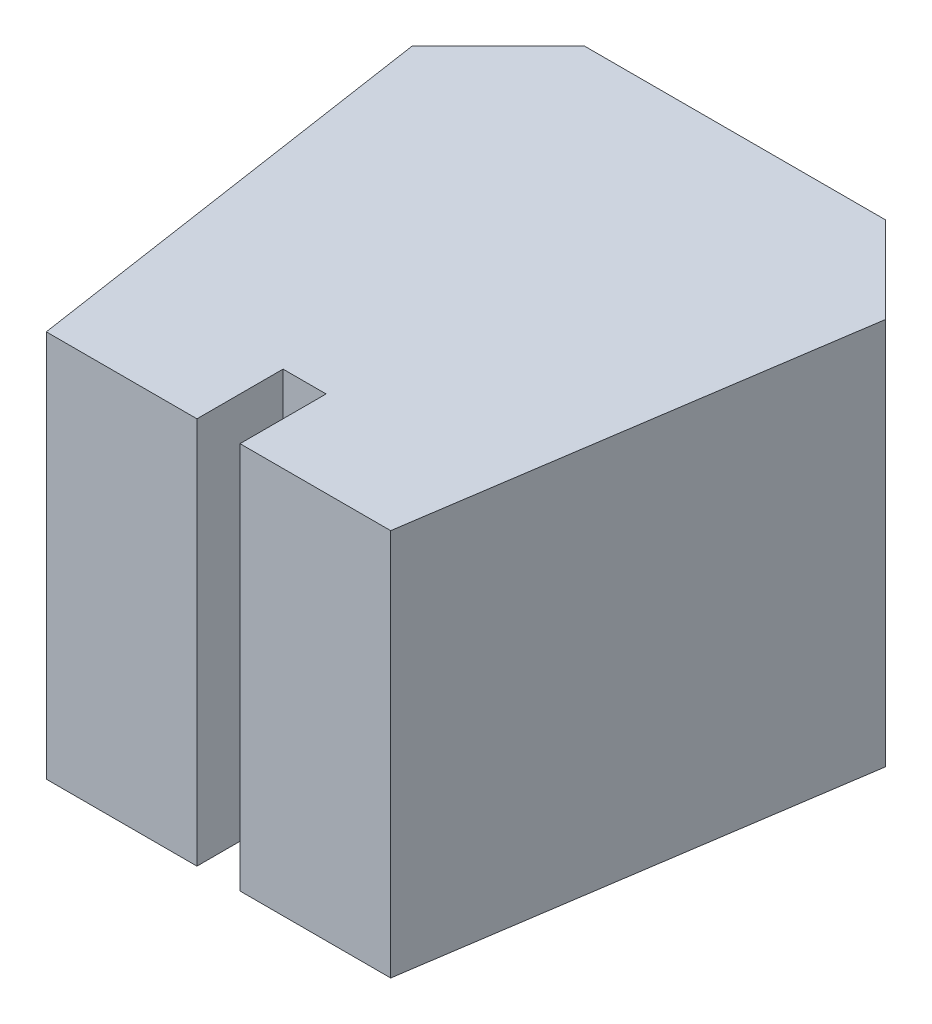
ISO-10303-21;
HEADER;
FILE_DESCRIPTION(('STEP AP214'),'2;1');
FILE_NAME('part.step','',(''),(''),'','','');
FILE_SCHEMA(('AUTOMOTIVE_DESIGN { 1 0 10303 214 1 1 1 1 }'));
ENDSEC;
DATA;
#1=APPLICATION_CONTEXT('core data for automotive mechanical design processes');
#2=APPLICATION_PROTOCOL_DEFINITION('international standard','automotive_design',2000,#1);
#3=PRODUCT_CONTEXT('',#1,'mechanical');
#4=PRODUCT('Part','Part','',(#3));
#5=PRODUCT_RELATED_PRODUCT_CATEGORY('part','',(#4));
#6=PRODUCT_DEFINITION_FORMATION('','',#4);
#7=PRODUCT_DEFINITION_CONTEXT('part definition',#1,'design');
#8=PRODUCT_DEFINITION('design','',#6,#7);
#9=PRODUCT_DEFINITION_SHAPE('','',#8);
#10=(LENGTH_UNIT() NAMED_UNIT(*) SI_UNIT(.MILLI.,.METRE.));
#11=(NAMED_UNIT(*) PLANE_ANGLE_UNIT() SI_UNIT($,.RADIAN.));
#12=(NAMED_UNIT(*) SI_UNIT($,.STERADIAN.) SOLID_ANGLE_UNIT());
#13=UNCERTAINTY_MEASURE_WITH_UNIT(LENGTH_MEASURE(1.E-05),#10,'distance_accuracy_value','');
#14=(GEOMETRIC_REPRESENTATION_CONTEXT(3) GLOBAL_UNCERTAINTY_ASSIGNED_CONTEXT((#13)) GLOBAL_UNIT_ASSIGNED_CONTEXT((#10,
#11,#12)) REPRESENTATION_CONTEXT('',''));
#15=CARTESIAN_POINT('',(0.,0.,0.));
#16=DIRECTION('',(0.,0.,1.));
#17=DIRECTION('',(1.,0.,0.));
#18=AXIS2_PLACEMENT_3D('',#15,#16,#17);
#19=CARTESIAN_POINT('',(-400000.,-18849.9999999979,199.999999999989));
#20=DIRECTION('',(0.,0.,1.));
#21=DIRECTION('',(1.,0.,0.));
#22=AXIS2_PLACEMENT_3D('',#19,#20,#21);
#23=PLANE('',#22);
#24=DIRECTION('',(0.,-1.,0.));
#25=VECTOR('',#24,1.);
#26=CARTESIAN_POINT('',(-24.9999999999773,-18850.0000000007,199.999999999989));
#27=LINE('',#26,#25);
#28=CARTESIAN_POINT('',(-24.9999999999773,-18850.0000000007,199.999999999989));
#29=VERTEX_POINT('',#28);
#30=CARTESIAN_POINT('',(-24.9999999999773,-19300.0000000007,199.999999999989));
#31=VERTEX_POINT('',#30);
#32=EDGE_CURVE('E36',#29,#31,#27,.T.);
#33=ORIENTED_EDGE('',*,*,#32,.T.);
#34=DIRECTION('',(-1.,0.,0.));
#35=VECTOR('',#34,1.);
#36=CARTESIAN_POINT('',(-400000.,-19299.9999999979,199.999999999989));
#37=LINE('',#36,#35);
#38=CARTESIAN_POINT('',(24.9999999999773,-19300.0000000007,199.999999999989));
#39=VERTEX_POINT('',#38);
#40=EDGE_CURVE('E110',#39,#31,#37,.T.);
#41=ORIENTED_EDGE('',*,*,#40,.F.);
#42=DIRECTION('',(0.,-1.,0.));
#43=VECTOR('',#42,1.);
#44=CARTESIAN_POINT('',(24.9999999999773,-18850.0000000007,199.999999999989));
#45=LINE('',#44,#43);
#46=CARTESIAN_POINT('',(24.9999999999773,-18850.0000000007,199.999999999989));
#47=VERTEX_POINT('',#46);
#48=EDGE_CURVE('E11',#47,#39,#45,.T.);
#49=ORIENTED_EDGE('',*,*,#48,.F.);
#50=DIRECTION('',(-1.,0.,0.));
#51=VECTOR('',#50,1.);
#52=CARTESIAN_POINT('',(-400000.,-18849.9999999979,199.999999999989));
#53=LINE('',#52,#51);
#54=EDGE_CURVE('E112',#47,#29,#53,.T.);
#55=ORIENTED_EDGE('',*,*,#54,.T.);
#56=EDGE_LOOP('',(#33,#41,#49,#55));
#57=FACE_BOUND('',#56,.T.);
#58=ADVANCED_FACE('F33',(#57),#23,.T.);
#59=CARTESIAN_POINT('',(24.9999999999773,-18850.0000000006,-291199.801905118));
#60=DIRECTION('',(1.,0.,0.));
#61=DIRECTION('',(0.,0.,-1.));
#62=AXIS2_PLACEMENT_3D('',#59,#60,#61);
#63=PLANE('',#62);
#64=ORIENTED_EDGE('',*,*,#48,.T.);
#65=DIRECTION('',(0.,0.,1.));
#66=VECTOR('',#65,1.);
#67=CARTESIAN_POINT('',(24.9999999999773,-19300.0000000006,-291199.801905118));
#68=LINE('',#67,#66);
#69=CARTESIAN_POINT('',(24.9999999999773,-19300.0000000007,300.000000000011));
#70=VERTEX_POINT('',#69);
#71=EDGE_CURVE('E128',#39,#70,#68,.T.);
#72=ORIENTED_EDGE('',*,*,#71,.T.);
#73=DIRECTION('',(0.,-1.,0.));
#74=VECTOR('',#73,1.);
#75=CARTESIAN_POINT('',(24.9999999999773,-18850.0000000007,300.000000000011));
#76=LINE('',#75,#74);
#77=CARTESIAN_POINT('',(24.9999999999773,-18850.0000000007,300.000000000011));
#78=VERTEX_POINT('',#77);
#79=EDGE_CURVE('E41',#78,#70,#76,.T.);
#80=ORIENTED_EDGE('',*,*,#79,.F.);
#81=DIRECTION('',(0.,0.,1.));
#82=VECTOR('',#81,1.);
#83=CARTESIAN_POINT('',(24.9999999999773,-18850.0000000006,-291199.801905118));
#84=LINE('',#83,#82);
#85=EDGE_CURVE('E54',#47,#78,#84,.T.);
#86=ORIENTED_EDGE('',*,*,#85,.F.);
#87=EDGE_LOOP('',(#64,#72,#80,#86));
#88=FACE_BOUND('',#87,.T.);
#89=ADVANCED_FACE('F214',(#88),#63,.F.);
#90=CARTESIAN_POINT('',(-400000.,-18849.9999999979,299.999999999955));
#91=DIRECTION('',(0.,0.,1.));
#92=DIRECTION('',(1.,0.,0.));
#93=AXIS2_PLACEMENT_3D('',#90,#91,#92);
#94=PLANE('',#93);
#95=ORIENTED_EDGE('',*,*,#79,.T.);
#96=DIRECTION('',(-1.,0.,0.));
#97=VECTOR('',#96,1.);
#98=CARTESIAN_POINT('',(-400000.,-19299.9999999979,299.999999999955));
#99=LINE('',#98,#97);
#100=CARTESIAN_POINT('',(199.999999999989,-19300.0000000007,300.00000000001));
#101=VERTEX_POINT('',#100);
#102=EDGE_CURVE('E147',#101,#70,#99,.T.);
#103=ORIENTED_EDGE('',*,*,#102,.F.);
#104=DIRECTION('',(0.,-1.,0.));
#105=VECTOR('',#104,1.);
#106=CARTESIAN_POINT('',(199.999999999989,-18850.0000000007,300.00000000001));
#107=LINE('',#106,#105);
#108=CARTESIAN_POINT('',(199.999999999989,-18850.0000000007,300.00000000001));
#109=VERTEX_POINT('',#108);
#110=EDGE_CURVE('E173',#109,#101,#107,.T.);
#111=ORIENTED_EDGE('',*,*,#110,.F.);
#112=DIRECTION('',(-1.,0.,0.));
#113=VECTOR('',#112,1.);
#114=CARTESIAN_POINT('',(-400000.,-18849.9999999979,299.999999999955));
#115=LINE('',#114,#113);
#116=EDGE_CURVE('E168',#109,#78,#115,.T.);
#117=ORIENTED_EDGE('',*,*,#116,.T.);
#118=EDGE_LOOP('',(#95,#103,#111,#117));
#119=FACE_BOUND('',#118,.T.);
#120=ADVANCED_FACE('F215',(#119),#94,.T.);
#121=CARTESIAN_POINT('',(34156.45015723,-18850.0000000009,-226076.334381534));
#122=DIRECTION('',(-0.988936352868298,0.,-0.148340452930244));
#123=DIRECTION('',(-0.148340452930244,0.,0.988936352868298));
#124=AXIS2_PLACEMENT_3D('',#121,#122,#123);
#125=PLANE('',#124);
#126=ORIENTED_EDGE('',*,*,#110,.T.);
#127=DIRECTION('',(0.148340452930244,0.,-0.988936352868298));
#128=VECTOR('',#127,1.);
#129=CARTESIAN_POINT('',(34156.45015723,-19300.0000000009,-226076.334381534));
#130=LINE('',#129,#128);
#131=CARTESIAN_POINT('',(274.999999999991,-19300.0000000007,-199.999999999875));
#132=VERTEX_POINT('',#131);
#133=EDGE_CURVE('E144',#101,#132,#130,.T.);
#134=ORIENTED_EDGE('',*,*,#133,.T.);
#135=DIRECTION('',(0.,-1.,0.));
#136=VECTOR('',#135,1.);
#137=CARTESIAN_POINT('',(274.999999999991,-18850.0000000007,-199.999999999875));
#138=LINE('',#137,#136);
#139=CARTESIAN_POINT('',(274.999999999991,-18850.0000000007,-199.999999999875));
#140=VERTEX_POINT('',#139);
#141=EDGE_CURVE('E175',#140,#132,#138,.T.);
#142=ORIENTED_EDGE('',*,*,#141,.F.);
#143=DIRECTION('',(0.148340452930244,0.,-0.988936352868298));
#144=VECTOR('',#143,1.);
#145=CARTESIAN_POINT('',(34156.45015723,-18850.0000000009,-226076.334381534));
#146=LINE('',#145,#144);
#147=EDGE_CURVE('E166',#109,#140,#146,.T.);
#148=ORIENTED_EDGE('',*,*,#147,.F.);
#149=EDGE_LOOP('',(#126,#134,#142,#148));
#150=FACE_BOUND('',#149,.T.);
#151=ADVANCED_FACE('F210',(#150),#125,.F.);
#152=CARTESIAN_POINT('',(-345362.400952559,-18849.9999999982,-345837.400952559));
#153=DIRECTION('',(-0.707106781186548,0.,0.707106781186548));
#154=DIRECTION('',(0.707106781186548,0.,0.707106781186548));
#155=AXIS2_PLACEMENT_3D('',#152,#153,#154);
#156=PLANE('',#155);
#157=ORIENTED_EDGE('',*,*,#141,.T.);
#158=DIRECTION('',(-0.707106781186548,0.,-0.707106781186548));
#159=VECTOR('',#158,1.);
#160=CARTESIAN_POINT('',(-345362.400952559,-19299.9999999982,-345837.400952559));
#161=LINE('',#160,#159);
#162=CARTESIAN_POINT('',(175.000000000068,-19300.0000000007,-299.999999999955));
#163=VERTEX_POINT('',#162);
#164=EDGE_CURVE('E141',#132,#163,#161,.T.);
#165=ORIENTED_EDGE('',*,*,#164,.T.);
#166=DIRECTION('',(0.,-1.,0.));
#167=VECTOR('',#166,1.);
#168=CARTESIAN_POINT('',(175.000000000068,-18850.0000000007,-299.999999999955));
#169=LINE('',#168,#167);
#170=CARTESIAN_POINT('',(175.000000000068,-18850.0000000007,-299.999999999955));
#171=VERTEX_POINT('',#170);
#172=EDGE_CURVE('E177',#171,#163,#169,.T.);
#173=ORIENTED_EDGE('',*,*,#172,.F.);
#174=DIRECTION('',(-0.707106781186548,0.,-0.707106781186548));
#175=VECTOR('',#174,1.);
#176=CARTESIAN_POINT('',(-345362.400952559,-18849.9999999982,-345837.400952559));
#177=LINE('',#176,#175);
#178=EDGE_CURVE('E164',#140,#171,#177,.T.);
#179=ORIENTED_EDGE('',*,*,#178,.F.);
#180=EDGE_LOOP('',(#157,#165,#173,#179));
#181=FACE_BOUND('',#180,.T.);
#182=ADVANCED_FACE('F206',(#181),#156,.F.);
#183=CARTESIAN_POINT('',(-400000.,-18849.9999999979,-300.000000000011));
#184=DIRECTION('',(0.,0.,1.));
#185=DIRECTION('',(1.,0.,0.));
#186=AXIS2_PLACEMENT_3D('',#183,#184,#185);
#187=PLANE('',#186);
#188=ORIENTED_EDGE('',*,*,#172,.T.);
#189=DIRECTION('',(-1.,0.,0.));
#190=VECTOR('',#189,1.);
#191=CARTESIAN_POINT('',(-400000.,-19299.9999999979,-300.000000000011));
#192=LINE('',#191,#190);
#193=CARTESIAN_POINT('',(-174.999999999955,-19300.0000000007,-300.000000000011));
#194=VERTEX_POINT('',#193);
#195=EDGE_CURVE('E138',#163,#194,#192,.T.);
#196=ORIENTED_EDGE('',*,*,#195,.T.);
#197=DIRECTION('',(0.,-1.,0.));
#198=VECTOR('',#197,1.);
#199=CARTESIAN_POINT('',(-174.999999999955,-18850.0000000007,-300.000000000011));
#200=LINE('',#199,#198);
#201=CARTESIAN_POINT('',(-174.999999999955,-18850.0000000007,-300.000000000011));
#202=VERTEX_POINT('',#201);
#203=EDGE_CURVE('E179',#202,#194,#200,.T.);
#204=ORIENTED_EDGE('',*,*,#203,.F.);
#205=DIRECTION('',(-1.,0.,0.));
#206=VECTOR('',#205,1.);
#207=CARTESIAN_POINT('',(-400000.,-18849.9999999979,-300.000000000011));
#208=LINE('',#207,#206);
#209=EDGE_CURVE('E162',#171,#202,#208,.T.);
#210=ORIENTED_EDGE('',*,*,#209,.F.);
#211=EDGE_LOOP('',(#188,#196,#204,#210));
#212=FACE_BOUND('',#211,.T.);
#213=ADVANCED_FACE('F201',(#212),#187,.F.);
#214=CARTESIAN_POINT('',(-54637.5990474408,-18850.0000000003,54162.5990474408));
#215=DIRECTION('',(-0.707106781186548,0.,-0.707106781186548));
#216=DIRECTION('',(-0.707106781186548,0.,0.707106781186548));
#217=AXIS2_PLACEMENT_3D('',#214,#215,#216);
#218=PLANE('',#217);
#219=ORIENTED_EDGE('',*,*,#203,.T.);
#220=DIRECTION('',(0.707106781186548,0.,-0.707106781186548));
#221=VECTOR('',#220,1.);
#222=CARTESIAN_POINT('',(-54637.5990474408,-19300.0000000003,54162.5990474408));
#223=LINE('',#222,#221);
#224=CARTESIAN_POINT('',(-274.999999999949,-19300.0000000007,-200.000000000017));
#225=VERTEX_POINT('',#224);
#226=EDGE_CURVE('E135',#225,#194,#223,.T.);
#227=ORIENTED_EDGE('',*,*,#226,.F.);
#228=DIRECTION('',(0.,-1.,0.));
#229=VECTOR('',#228,1.);
#230=CARTESIAN_POINT('',(-274.999999999949,-18850.0000000007,-200.000000000017));
#231=LINE('',#230,#229);
#232=CARTESIAN_POINT('',(-274.999999999949,-18850.0000000007,-200.000000000017));
#233=VERTEX_POINT('',#232);
#234=EDGE_CURVE('E181',#233,#225,#231,.T.);
#235=ORIENTED_EDGE('',*,*,#234,.F.);
#236=DIRECTION('',(0.707106781186548,0.,-0.707106781186548));
#237=VECTOR('',#236,1.);
#238=CARTESIAN_POINT('',(-54637.5990474408,-18850.0000000003,54162.5990474408));
#239=LINE('',#238,#237);
#240=EDGE_CURVE('E159',#233,#202,#239,.T.);
#241=ORIENTED_EDGE('',*,*,#240,.T.);
#242=EDGE_LOOP('',(#219,#227,#235,#241));
#243=FACE_BOUND('',#242,.T.);
#244=ADVANCED_FACE('F194',(#243),#218,.T.);
#245=CARTESIAN_POINT('',(-51760.3621376702,-18850.0000000003,-343435.747584468));
#246=DIRECTION('',(-0.988936352868298,0.,0.148340452930245));
#247=DIRECTION('',(0.148340452930245,0.,0.988936352868298));
#248=AXIS2_PLACEMENT_3D('',#245,#246,#247);
#249=PLANE('',#248);
#250=ORIENTED_EDGE('',*,*,#234,.T.);
#251=DIRECTION('',(-0.148340452930245,0.,-0.988936352868298));
#252=VECTOR('',#251,1.);
#253=CARTESIAN_POINT('',(-51760.3621376702,-19300.0000000003,-343435.747584468));
#254=LINE('',#253,#252);
#255=CARTESIAN_POINT('',(-199.999999999932,-19300.0000000007,300.000000000068));
#256=VERTEX_POINT('',#255);
#257=EDGE_CURVE('E132',#256,#225,#254,.T.);
#258=ORIENTED_EDGE('',*,*,#257,.F.);
#259=DIRECTION('',(0.,-1.,0.));
#260=VECTOR('',#259,1.);
#261=CARTESIAN_POINT('',(-199.999999999932,-18850.0000000007,300.000000000068));
#262=LINE('',#261,#260);
#263=CARTESIAN_POINT('',(-199.999999999932,-18850.0000000007,300.000000000068));
#264=VERTEX_POINT('',#263);
#265=EDGE_CURVE('E183',#264,#256,#262,.T.);
#266=ORIENTED_EDGE('',*,*,#265,.F.);
#267=DIRECTION('',(-0.148340452930245,0.,-0.988936352868298));
#268=VECTOR('',#267,1.);
#269=CARTESIAN_POINT('',(-51760.3621376702,-18850.0000000003,-343435.747584468));
#270=LINE('',#269,#268);
#271=EDGE_CURVE('E156',#264,#233,#270,.T.);
#272=ORIENTED_EDGE('',*,*,#271,.T.);
#273=EDGE_LOOP('',(#250,#258,#266,#272));
#274=FACE_BOUND('',#273,.T.);
#275=ADVANCED_FACE('F191',(#274),#249,.T.);
#276=CARTESIAN_POINT('',(-400000.,-18849.9999999979,299.999999999955));
#277=DIRECTION('',(0.,0.,1.));
#278=DIRECTION('',(1.,0.,0.));
#279=AXIS2_PLACEMENT_3D('',#276,#277,#278);
#280=PLANE('',#279);
#281=ORIENTED_EDGE('',*,*,#265,.T.);
#282=DIRECTION('',(-1.,0.,0.));
#283=VECTOR('',#282,1.);
#284=CARTESIAN_POINT('',(-400000.,-19299.9999999979,299.999999999955));
#285=LINE('',#284,#283);
#286=CARTESIAN_POINT('',(-24.9999999999773,-19300.0000000007,300.00000000001));
#287=VERTEX_POINT('',#286);
#288=EDGE_CURVE('E123',#287,#256,#285,.T.);
#289=ORIENTED_EDGE('',*,*,#288,.F.);
#290=DIRECTION('',(0.,-1.,0.));
#291=VECTOR('',#290,1.);
#292=CARTESIAN_POINT('',(-24.9999999999773,-18850.0000000007,300.00000000001));
#293=LINE('',#292,#291);
#294=CARTESIAN_POINT('',(-24.9999999999773,-18850.0000000007,300.00000000001));
#295=VERTEX_POINT('',#294);
#296=EDGE_CURVE('E116',#295,#287,#293,.T.);
#297=ORIENTED_EDGE('',*,*,#296,.F.);
#298=DIRECTION('',(-1.,0.,0.));
#299=VECTOR('',#298,1.);
#300=CARTESIAN_POINT('',(-400000.,-18849.9999999979,299.999999999955));
#301=LINE('',#300,#299);
#302=EDGE_CURVE('E153',#295,#264,#301,.T.);
#303=ORIENTED_EDGE('',*,*,#302,.T.);
#304=EDGE_LOOP('',(#281,#289,#297,#303));
#305=FACE_BOUND('',#304,.T.);
#306=ADVANCED_FACE('F185',(#305),#280,.T.);
#307=CARTESIAN_POINT('',(-24.9999999999773,-18850.0000000006,-291199.801905118));
#308=DIRECTION('',(1.,0.,0.));
#309=DIRECTION('',(0.,0.,-1.));
#310=AXIS2_PLACEMENT_3D('',#307,#308,#309);
#311=PLANE('',#310);
#312=ORIENTED_EDGE('',*,*,#296,.T.);
#313=DIRECTION('',(0.,0.,1.));
#314=VECTOR('',#313,1.);
#315=CARTESIAN_POINT('',(-24.9999999999773,-19300.0000000006,-291199.801905118));
#316=LINE('',#315,#314);
#317=EDGE_CURVE('E118',#31,#287,#316,.T.);
#318=ORIENTED_EDGE('',*,*,#317,.F.);
#319=ORIENTED_EDGE('',*,*,#32,.F.);
#320=DIRECTION('',(0.,0.,1.));
#321=VECTOR('',#320,1.);
#322=CARTESIAN_POINT('',(-24.9999999999773,-18850.0000000006,-291199.801905118));
#323=LINE('',#322,#321);
#324=EDGE_CURVE('E151',#29,#295,#323,.T.);
#325=ORIENTED_EDGE('',*,*,#324,.T.);
#326=EDGE_LOOP('',(#312,#318,#319,#325));
#327=FACE_BOUND('',#326,.T.);
#328=ADVANCED_FACE('F119',(#327),#311,.T.);
#329=CARTESIAN_POINT('',(-1.29755550065731E-10,-18850.0000000007,-4.16385675938728E-12));
#330=DIRECTION('',(0.,1.,0.));
#331=DIRECTION('',(-1.,0.,0.));
#332=AXIS2_PLACEMENT_3D('',#329,#330,#331);
#333=PLANE('',#332);
#334=ORIENTED_EDGE('',*,*,#54,.F.);
#335=ORIENTED_EDGE('',*,*,#85,.T.);
#336=ORIENTED_EDGE('',*,*,#116,.F.);
#337=ORIENTED_EDGE('',*,*,#147,.T.);
#338=ORIENTED_EDGE('',*,*,#178,.T.);
#339=ORIENTED_EDGE('',*,*,#209,.T.);
#340=ORIENTED_EDGE('',*,*,#240,.F.);
#341=ORIENTED_EDGE('',*,*,#271,.F.);
#342=ORIENTED_EDGE('',*,*,#302,.F.);
#343=ORIENTED_EDGE('',*,*,#324,.F.);
#344=EDGE_LOOP('',(#334,#335,#336,#337,#338,#339,#340,#341,#342,#343));
#345=FACE_BOUND('',#344,.T.);
#346=ADVANCED_FACE('F195',(#345),#333,.T.);
#347=CARTESIAN_POINT('',(-1.29755550065731E-10,-19300.0000000007,-4.16385675938728E-12));
#348=DIRECTION('',(0.,1.,0.));
#349=DIRECTION('',(-1.,0.,0.));
#350=AXIS2_PLACEMENT_3D('',#347,#348,#349);
#351=PLANE('',#350);
#352=ORIENTED_EDGE('',*,*,#40,.T.);
#353=ORIENTED_EDGE('',*,*,#317,.T.);
#354=ORIENTED_EDGE('',*,*,#288,.T.);
#355=ORIENTED_EDGE('',*,*,#257,.T.);
#356=ORIENTED_EDGE('',*,*,#226,.T.);
#357=ORIENTED_EDGE('',*,*,#195,.F.);
#358=ORIENTED_EDGE('',*,*,#164,.F.);
#359=ORIENTED_EDGE('',*,*,#133,.F.);
#360=ORIENTED_EDGE('',*,*,#102,.T.);
#361=ORIENTED_EDGE('',*,*,#71,.F.);
#362=EDGE_LOOP('',(#352,#353,#354,#355,#356,#357,#358,#359,#360,#361));
#363=FACE_BOUND('',#362,.T.);
#364=ADVANCED_FACE('F125',(#363),#351,.F.);
#365=CLOSED_SHELL('',(#58,#89,#120,#151,#182,#213,#244,#275,#306,#328,#346,#364));
#366=MANIFOLD_SOLID_BREP('B2',#365);
#367=ADVANCED_BREP_SHAPE_REPRESENTATION('',(#18,#366),#14);
#368=SHAPE_DEFINITION_REPRESENTATION(#9,#367);
ENDSEC;
END-ISO-10303-21;
